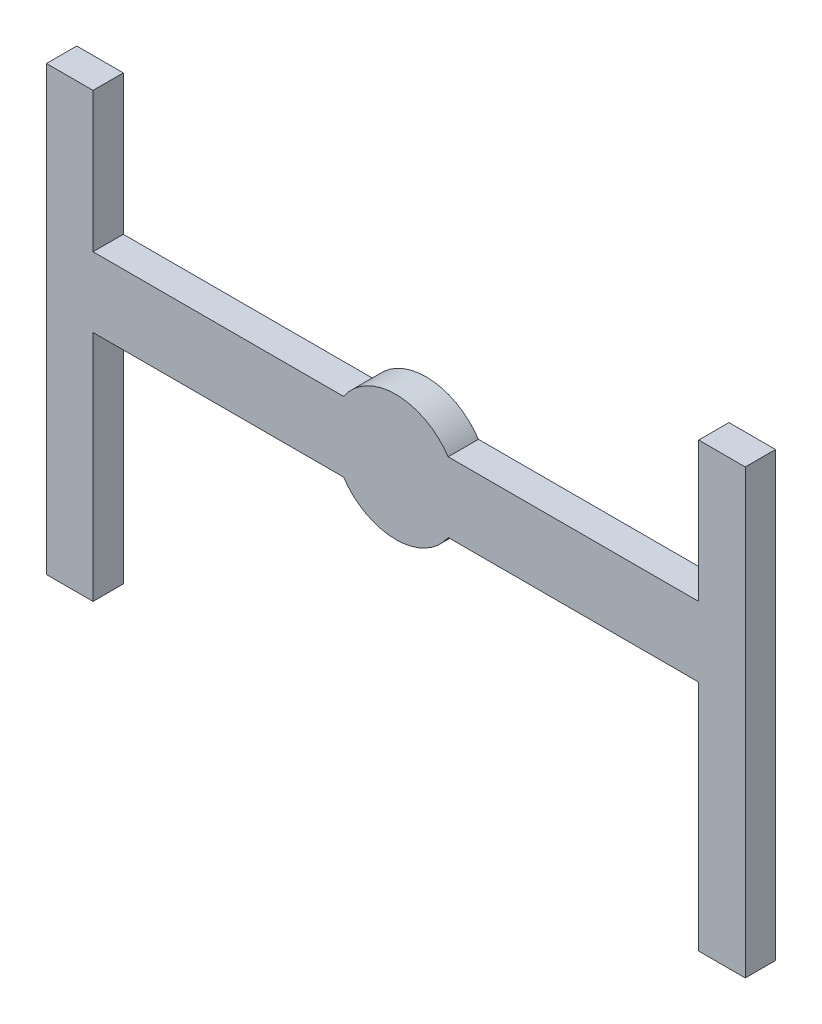
ISO-10303-21;
HEADER;
FILE_DESCRIPTION(('STEP AP214'),'2;1');
FILE_NAME('part.step','',(''),(''),'','','');
FILE_SCHEMA(('AUTOMOTIVE_DESIGN { 1 0 10303 214 1 1 1 1 }'));
ENDSEC;
DATA;
#1=APPLICATION_CONTEXT('core data for automotive mechanical design processes');
#2=APPLICATION_PROTOCOL_DEFINITION('international standard','automotive_design',2000,#1);
#3=PRODUCT_CONTEXT('',#1,'mechanical');
#4=PRODUCT('Part','Part','',(#3));
#5=PRODUCT_RELATED_PRODUCT_CATEGORY('part','',(#4));
#6=PRODUCT_DEFINITION_FORMATION('','',#4);
#7=PRODUCT_DEFINITION_CONTEXT('part definition',#1,'design');
#8=PRODUCT_DEFINITION('design','',#6,#7);
#9=PRODUCT_DEFINITION_SHAPE('','',#8);
#10=(LENGTH_UNIT() NAMED_UNIT(*) SI_UNIT(.MILLI.,.METRE.));
#11=(NAMED_UNIT(*) PLANE_ANGLE_UNIT() SI_UNIT($,.RADIAN.));
#12=(NAMED_UNIT(*) SI_UNIT($,.STERADIAN.) SOLID_ANGLE_UNIT());
#13=UNCERTAINTY_MEASURE_WITH_UNIT(LENGTH_MEASURE(1.E-05),#10,'distance_accuracy_value','');
#14=(GEOMETRIC_REPRESENTATION_CONTEXT(3) GLOBAL_UNCERTAINTY_ASSIGNED_CONTEXT((#13)) GLOBAL_UNIT_ASSIGNED_CONTEXT((#10,
#11,#12)) REPRESENTATION_CONTEXT('',''));
#15=CARTESIAN_POINT('',(0.,0.,0.));
#16=DIRECTION('',(0.,0.,1.));
#17=DIRECTION('',(1.,0.,0.));
#18=AXIS2_PLACEMENT_3D('',#15,#16,#17);
#19=CARTESIAN_POINT('',(-4.44089209850063E-13,1900.,-130.));
#20=DIRECTION('',(0.,-1.,0.));
#21=DIRECTION('',(0.,0.,-1.));
#22=AXIS2_PLACEMENT_3D('',#19,#20,#21);
#23=PLANE('',#22);
#24=DIRECTION('',(1.,0.,0.));
#25=VECTOR('',#24,1.);
#26=CARTESIAN_POINT('',(-4.44089209850063E-13,1900.,0.));
#27=LINE('',#26,#25);
#28=CARTESIAN_POINT('',(-4.44089209850063E-13,1900.,0.));
#29=VERTEX_POINT('',#28);
#30=CARTESIAN_POINT('',(200.,1900.,0.));
#31=VERTEX_POINT('',#30);
#32=EDGE_CURVE('E254',#29,#31,#27,.T.);
#33=ORIENTED_EDGE('',*,*,#32,.T.);
#34=DIRECTION('',(0.,0.,1.));
#35=VECTOR('',#34,1.);
#36=CARTESIAN_POINT('',(200.,1900.,-130.));
#37=LINE('',#36,#35);
#38=CARTESIAN_POINT('',(200.,1900.,-130.));
#39=VERTEX_POINT('',#38);
#40=EDGE_CURVE('E194',#39,#31,#37,.T.);
#41=ORIENTED_EDGE('',*,*,#40,.F.);
#42=DIRECTION('',(1.,0.,0.));
#43=VECTOR('',#42,1.);
#44=CARTESIAN_POINT('',(-4.44089209850063E-13,1900.,-130.));
#45=LINE('',#44,#43);
#46=CARTESIAN_POINT('',(-4.44089209850063E-13,1900.,-130.));
#47=VERTEX_POINT('',#46);
#48=EDGE_CURVE('E240',#47,#39,#45,.T.);
#49=ORIENTED_EDGE('',*,*,#48,.F.);
#50=DIRECTION('',(0.,0.,1.));
#51=VECTOR('',#50,1.);
#52=CARTESIAN_POINT('',(-4.44089209850063E-13,1900.,-130.));
#53=LINE('',#52,#51);
#54=EDGE_CURVE('E11',#47,#29,#53,.T.);
#55=ORIENTED_EDGE('',*,*,#54,.T.);
#56=EDGE_LOOP('',(#33,#41,#49,#55));
#57=FACE_BOUND('',#56,.T.);
#58=ADVANCED_FACE('F35',(#57),#23,.F.);
#59=CARTESIAN_POINT('',(0.,0.,-130.));
#60=DIRECTION('',(0.,-1.,0.));
#61=DIRECTION('',(0.,0.,-1.));
#62=AXIS2_PLACEMENT_3D('',#59,#60,#61);
#63=PLANE('',#62);
#64=DIRECTION('',(1.,0.,0.));
#65=VECTOR('',#64,1.);
#66=CARTESIAN_POINT('',(0.,0.,0.));
#67=LINE('',#66,#65);
#68=CARTESIAN_POINT('',(2800.,0.,0.));
#69=VERTEX_POINT('',#68);
#70=CARTESIAN_POINT('',(3000.,0.,0.));
#71=VERTEX_POINT('',#70);
#72=EDGE_CURVE('E260',#69,#71,#67,.T.);
#73=ORIENTED_EDGE('',*,*,#72,.F.);
#74=DIRECTION('',(0.,0.,1.));
#75=VECTOR('',#74,1.);
#76=CARTESIAN_POINT('',(2800.,0.,-130.));
#77=LINE('',#76,#75);
#78=CARTESIAN_POINT('',(2800.,0.,-130.));
#79=VERTEX_POINT('',#78);
#80=EDGE_CURVE('E227',#79,#69,#77,.T.);
#81=ORIENTED_EDGE('',*,*,#80,.F.);
#82=DIRECTION('',(1.,0.,0.));
#83=VECTOR('',#82,1.);
#84=CARTESIAN_POINT('',(0.,0.,-130.));
#85=LINE('',#84,#83);
#86=CARTESIAN_POINT('',(3000.,0.,-130.));
#87=VERTEX_POINT('',#86);
#88=EDGE_CURVE('E246',#79,#87,#85,.T.);
#89=ORIENTED_EDGE('',*,*,#88,.T.);
#90=DIRECTION('',(0.,0.,1.));
#91=VECTOR('',#90,1.);
#92=CARTESIAN_POINT('',(3000.,0.,-130.));
#93=LINE('',#92,#91);
#94=EDGE_CURVE('E264',#87,#71,#93,.T.);
#95=ORIENTED_EDGE('',*,*,#94,.T.);
#96=EDGE_LOOP('',(#73,#81,#89,#95));
#97=FACE_BOUND('',#96,.T.);
#98=ADVANCED_FACE('F284',(#97),#63,.T.);
#99=CARTESIAN_POINT('',(0.,0.,-130.));
#100=VERTEX_POINT('',#99);
#101=CARTESIAN_POINT('',(200.,0.,-130.));
#102=VERTEX_POINT('',#101);
#103=EDGE_CURVE('E247',#100,#102,#85,.T.);
#104=ORIENTED_EDGE('',*,*,#103,.T.);
#105=DIRECTION('',(0.,0.,1.));
#106=VECTOR('',#105,1.);
#107=CARTESIAN_POINT('',(200.,0.,-130.));
#108=LINE('',#107,#106);
#109=CARTESIAN_POINT('',(200.,0.,0.));
#110=VERTEX_POINT('',#109);
#111=EDGE_CURVE('E229',#102,#110,#108,.T.);
#112=ORIENTED_EDGE('',*,*,#111,.T.);
#113=CARTESIAN_POINT('',(0.,0.,0.));
#114=VERTEX_POINT('',#113);
#115=EDGE_CURVE('E239',#114,#110,#67,.T.);
#116=ORIENTED_EDGE('',*,*,#115,.F.);
#117=DIRECTION('',(0.,0.,1.));
#118=VECTOR('',#117,1.);
#119=CARTESIAN_POINT('',(0.,0.,-130.));
#120=LINE('',#119,#118);
#121=EDGE_CURVE('E250',#100,#114,#120,.T.);
#122=ORIENTED_EDGE('',*,*,#121,.F.);
#123=EDGE_LOOP('',(#104,#112,#116,#122));
#124=FACE_BOUND('',#123,.T.);
#125=ADVANCED_FACE('F305',(#124),#63,.T.);
#126=CARTESIAN_POINT('',(0.,0.,-130.));
#127=DIRECTION('',(0.,0.,-1.));
#128=DIRECTION('',(-1.,0.,0.));
#129=AXIS2_PLACEMENT_3D('',#126,#127,#128);
#130=PLANE('',#129);
#131=DIRECTION('',(0.,-1.,0.));
#132=VECTOR('',#131,1.);
#133=CARTESIAN_POINT('',(200.000000000001,0.,-130.));
#134=LINE('',#133,#132);
#135=CARTESIAN_POINT('',(200.,1300.,-130.));
#136=VERTEX_POINT('',#135);
#137=EDGE_CURVE('E178',#39,#136,#134,.T.);
#138=ORIENTED_EDGE('',*,*,#137,.T.);
#139=DIRECTION('',(1.,0.,0.));
#140=VECTOR('',#139,1.);
#141=CARTESIAN_POINT('',(0.,1300.,-130.));
#142=LINE('',#141,#140);
#143=CARTESIAN_POINT('',(1275.50055679356,1300.,-130.));
#144=VERTEX_POINT('',#143);
#145=EDGE_CURVE('E157',#136,#144,#142,.T.);
#146=ORIENTED_EDGE('',*,*,#145,.T.);
#147=CARTESIAN_POINT('',(1500.,1150.,-130.));
#148=DIRECTION('',(0.,0.,1.));
#149=DIRECTION('',(1.,0.,0.));
#150=AXIS2_PLACEMENT_3D('',#147,#148,#149);
#151=CIRCLE('',#150,270.);
#152=CARTESIAN_POINT('',(1724.49944320644,1300.,-130.));
#153=VERTEX_POINT('',#152);
#154=EDGE_CURVE('E151',#153,#144,#151,.T.);
#155=ORIENTED_EDGE('',*,*,#154,.F.);
#156=DIRECTION('',(1.,0.,0.));
#157=VECTOR('',#156,1.);
#158=CARTESIAN_POINT('',(0.,1300.,-130.));
#159=LINE('',#158,#157);
#160=CARTESIAN_POINT('',(2800.,1300.,-130.));
#161=VERTEX_POINT('',#160);
#162=EDGE_CURVE('E160',#153,#161,#159,.T.);
#163=ORIENTED_EDGE('',*,*,#162,.T.);
#164=DIRECTION('',(0.,1.,0.));
#165=VECTOR('',#164,1.);
#166=CARTESIAN_POINT('',(2800.,0.,-130.));
#167=LINE('',#166,#165);
#168=CARTESIAN_POINT('',(2800.,1900.,-130.));
#169=VERTEX_POINT('',#168);
#170=EDGE_CURVE('E165',#161,#169,#167,.T.);
#171=ORIENTED_EDGE('',*,*,#170,.T.);
#172=CARTESIAN_POINT('',(3000.,1900.,-130.));
#173=VERTEX_POINT('',#172);
#174=EDGE_CURVE('E238',#169,#173,#45,.T.);
#175=ORIENTED_EDGE('',*,*,#174,.T.);
#176=DIRECTION('',(0.,1.,0.));
#177=VECTOR('',#176,1.);
#178=CARTESIAN_POINT('',(3000.,0.,-130.));
#179=LINE('',#178,#177);
#180=EDGE_CURVE('E243',#87,#173,#179,.T.);
#181=ORIENTED_EDGE('',*,*,#180,.F.);
#182=ORIENTED_EDGE('',*,*,#88,.F.);
#183=DIRECTION('',(0.,-1.,0.));
#184=VECTOR('',#183,1.);
#185=CARTESIAN_POINT('',(2800.,0.,-130.));
#186=LINE('',#185,#184);
#187=CARTESIAN_POINT('',(2800.,1000.,-130.));
#188=VERTEX_POINT('',#187);
#189=EDGE_CURVE('E207',#188,#79,#186,.T.);
#190=ORIENTED_EDGE('',*,*,#189,.F.);
#191=DIRECTION('',(1.,0.,0.));
#192=VECTOR('',#191,1.);
#193=CARTESIAN_POINT('',(0.,1000.,-130.));
#194=LINE('',#193,#192);
#195=CARTESIAN_POINT('',(1724.49944320644,1000.,-130.));
#196=VERTEX_POINT('',#195);
#197=EDGE_CURVE('E209',#196,#188,#194,.T.);
#198=ORIENTED_EDGE('',*,*,#197,.F.);
#199=CARTESIAN_POINT('',(1500.,1150.,-130.));
#200=DIRECTION('',(0.,0.,1.));
#201=DIRECTION('',(1.,0.,0.));
#202=AXIS2_PLACEMENT_3D('',#199,#200,#201);
#203=CIRCLE('',#202,270.);
#204=CARTESIAN_POINT('',(1275.50055679356,1000.,-130.));
#205=VERTEX_POINT('',#204);
#206=EDGE_CURVE('E200',#205,#196,#203,.T.);
#207=ORIENTED_EDGE('',*,*,#206,.F.);
#208=DIRECTION('',(1.,0.,0.));
#209=VECTOR('',#208,1.);
#210=CARTESIAN_POINT('',(-1.03228493710418E-13,1000.,-130.));
#211=LINE('',#210,#209);
#212=CARTESIAN_POINT('',(200.,1000.,-130.));
#213=VERTEX_POINT('',#212);
#214=EDGE_CURVE('E202',#213,#205,#211,.T.);
#215=ORIENTED_EDGE('',*,*,#214,.F.);
#216=DIRECTION('',(0.,1.,0.));
#217=VECTOR('',#216,1.);
#218=CARTESIAN_POINT('',(200.,0.,-130.));
#219=LINE('',#218,#217);
#220=EDGE_CURVE('E205',#102,#213,#219,.T.);
#221=ORIENTED_EDGE('',*,*,#220,.F.);
#222=ORIENTED_EDGE('',*,*,#103,.F.);
#223=DIRECTION('',(0.,1.,0.));
#224=VECTOR('',#223,1.);
#225=CARTESIAN_POINT('',(0.,0.,-130.));
#226=LINE('',#225,#224);
#227=EDGE_CURVE('E235',#100,#47,#226,.T.);
#228=ORIENTED_EDGE('',*,*,#227,.T.);
#229=ORIENTED_EDGE('',*,*,#48,.T.);
#230=EDGE_LOOP('',(#138,#146,#155,#163,#171,#175,#181,#182,#190,#198,#207,#215,#221,#222,#228,#229));
#231=FACE_BOUND('',#230,.T.);
#232=ADVANCED_FACE('F169',(#231),#130,.T.);
#233=CARTESIAN_POINT('',(0.,0.,0.));
#234=DIRECTION('',(0.,0.,-1.));
#235=DIRECTION('',(-1.,0.,0.));
#236=AXIS2_PLACEMENT_3D('',#233,#234,#235);
#237=PLANE('',#236);
#238=DIRECTION('',(1.,0.,0.));
#239=VECTOR('',#238,1.);
#240=CARTESIAN_POINT('',(0.,1300.,0.));
#241=LINE('',#240,#239);
#242=CARTESIAN_POINT('',(200.,1300.,0.));
#243=VERTEX_POINT('',#242);
#244=CARTESIAN_POINT('',(1275.50055679356,1300.,0.));
#245=VERTEX_POINT('',#244);
#246=EDGE_CURVE('E171',#243,#245,#241,.T.);
#247=ORIENTED_EDGE('',*,*,#246,.F.);
#248=DIRECTION('',(0.,-1.,0.));
#249=VECTOR('',#248,1.);
#250=CARTESIAN_POINT('',(200.000000000001,0.,0.));
#251=LINE('',#250,#249);
#252=EDGE_CURVE('E174',#31,#243,#251,.T.);
#253=ORIENTED_EDGE('',*,*,#252,.F.);
#254=ORIENTED_EDGE('',*,*,#32,.F.);
#255=DIRECTION('',(0.,1.,0.));
#256=VECTOR('',#255,1.);
#257=CARTESIAN_POINT('',(0.,0.,0.));
#258=LINE('',#257,#256);
#259=EDGE_CURVE('E191',#114,#29,#258,.T.);
#260=ORIENTED_EDGE('',*,*,#259,.F.);
#261=ORIENTED_EDGE('',*,*,#115,.T.);
#262=DIRECTION('',(0.,1.,0.));
#263=VECTOR('',#262,1.);
#264=CARTESIAN_POINT('',(200.,0.,0.));
#265=LINE('',#264,#263);
#266=CARTESIAN_POINT('',(200.,1000.,0.));
#267=VERTEX_POINT('',#266);
#268=EDGE_CURVE('E216',#110,#267,#265,.T.);
#269=ORIENTED_EDGE('',*,*,#268,.T.);
#270=DIRECTION('',(1.,0.,0.));
#271=VECTOR('',#270,1.);
#272=CARTESIAN_POINT('',(-1.03228493710418E-13,1000.,0.));
#273=LINE('',#272,#271);
#274=CARTESIAN_POINT('',(1275.50055679356,1000.,0.));
#275=VERTEX_POINT('',#274);
#276=EDGE_CURVE('E213',#267,#275,#273,.T.);
#277=ORIENTED_EDGE('',*,*,#276,.T.);
#278=CARTESIAN_POINT('',(1500.,1150.,0.));
#279=DIRECTION('',(0.,0.,1.));
#280=DIRECTION('',(1.,0.,0.));
#281=AXIS2_PLACEMENT_3D('',#278,#279,#280);
#282=CIRCLE('',#281,270.);
#283=CARTESIAN_POINT('',(1724.49944320644,1000.,0.));
#284=VERTEX_POINT('',#283);
#285=EDGE_CURVE('E58',#275,#284,#282,.T.);
#286=ORIENTED_EDGE('',*,*,#285,.T.);
#287=DIRECTION('',(1.,0.,0.));
#288=VECTOR('',#287,1.);
#289=CARTESIAN_POINT('',(0.,1000.,0.));
#290=LINE('',#289,#288);
#291=CARTESIAN_POINT('',(2800.,1000.,0.));
#292=VERTEX_POINT('',#291);
#293=EDGE_CURVE('E203',#284,#292,#290,.T.);
#294=ORIENTED_EDGE('',*,*,#293,.T.);
#295=DIRECTION('',(0.,-1.,0.));
#296=VECTOR('',#295,1.);
#297=CARTESIAN_POINT('',(2800.,0.,0.));
#298=LINE('',#297,#296);
#299=EDGE_CURVE('E219',#292,#69,#298,.T.);
#300=ORIENTED_EDGE('',*,*,#299,.T.);
#301=ORIENTED_EDGE('',*,*,#72,.T.);
#302=DIRECTION('',(0.,1.,0.));
#303=VECTOR('',#302,1.);
#304=CARTESIAN_POINT('',(3000.,0.,0.));
#305=LINE('',#304,#303);
#306=CARTESIAN_POINT('',(3000.,1900.,0.));
#307=VERTEX_POINT('',#306);
#308=EDGE_CURVE('E257',#71,#307,#305,.T.);
#309=ORIENTED_EDGE('',*,*,#308,.T.);
#310=CARTESIAN_POINT('',(2800.,1900.,0.));
#311=VERTEX_POINT('',#310);
#312=EDGE_CURVE('E253',#311,#307,#27,.T.);
#313=ORIENTED_EDGE('',*,*,#312,.F.);
#314=DIRECTION('',(0.,1.,0.));
#315=VECTOR('',#314,1.);
#316=CARTESIAN_POINT('',(2800.,0.,0.));
#317=LINE('',#316,#315);
#318=CARTESIAN_POINT('',(2800.,1300.,0.));
#319=VERTEX_POINT('',#318);
#320=EDGE_CURVE('E185',#319,#311,#317,.T.);
#321=ORIENTED_EDGE('',*,*,#320,.F.);
#322=DIRECTION('',(1.,0.,0.));
#323=VECTOR('',#322,1.);
#324=CARTESIAN_POINT('',(0.,1300.,0.));
#325=LINE('',#324,#323);
#326=CARTESIAN_POINT('',(1724.49944320644,1300.,0.));
#327=VERTEX_POINT('',#326);
#328=EDGE_CURVE('E182',#327,#319,#325,.T.);
#329=ORIENTED_EDGE('',*,*,#328,.F.);
#330=CARTESIAN_POINT('',(1500.,1150.,0.));
#331=DIRECTION('',(0.,0.,1.));
#332=DIRECTION('',(1.,0.,0.));
#333=AXIS2_PLACEMENT_3D('',#330,#331,#332);
#334=CIRCLE('',#333,270.);
#335=EDGE_CURVE('E50',#327,#245,#334,.T.);
#336=ORIENTED_EDGE('',*,*,#335,.T.);
#337=EDGE_LOOP('',(#247,#253,#254,#260,#261,#269,#277,#286,#294,#300,#301,#309,#313,#321,#329,#336));
#338=FACE_BOUND('',#337,.T.);
#339=ADVANCED_FACE('F278',(#338),#237,.F.);
#340=CARTESIAN_POINT('',(0.,0.,-130.));
#341=DIRECTION('',(1.,0.,0.));
#342=DIRECTION('',(0.,1.,0.));
#343=AXIS2_PLACEMENT_3D('',#340,#341,#342);
#344=PLANE('',#343);
#345=ORIENTED_EDGE('',*,*,#259,.T.);
#346=ORIENTED_EDGE('',*,*,#54,.F.);
#347=ORIENTED_EDGE('',*,*,#227,.F.);
#348=ORIENTED_EDGE('',*,*,#121,.T.);
#349=EDGE_LOOP('',(#345,#346,#347,#348));
#350=FACE_BOUND('',#349,.T.);
#351=ADVANCED_FACE('F37',(#350),#344,.F.);
#352=ORIENTED_EDGE('',*,*,#174,.F.);
#353=DIRECTION('',(0.,0.,1.));
#354=VECTOR('',#353,1.);
#355=CARTESIAN_POINT('',(2800.,1900.,-130.));
#356=LINE('',#355,#354);
#357=EDGE_CURVE('E196',#169,#311,#356,.T.);
#358=ORIENTED_EDGE('',*,*,#357,.T.);
#359=ORIENTED_EDGE('',*,*,#312,.T.);
#360=DIRECTION('',(0.,0.,1.));
#361=VECTOR('',#360,1.);
#362=CARTESIAN_POINT('',(3000.,1900.,-130.));
#363=LINE('',#362,#361);
#364=EDGE_CURVE('E43',#173,#307,#363,.T.);
#365=ORIENTED_EDGE('',*,*,#364,.F.);
#366=EDGE_LOOP('',(#352,#358,#359,#365));
#367=FACE_BOUND('',#366,.T.);
#368=ADVANCED_FACE('F287',(#367),#23,.F.);
#369=CARTESIAN_POINT('',(3000.,0.,-130.));
#370=DIRECTION('',(1.,0.,0.));
#371=DIRECTION('',(0.,1.,0.));
#372=AXIS2_PLACEMENT_3D('',#369,#370,#371);
#373=PLANE('',#372);
#374=ORIENTED_EDGE('',*,*,#308,.F.);
#375=ORIENTED_EDGE('',*,*,#94,.F.);
#376=ORIENTED_EDGE('',*,*,#180,.T.);
#377=ORIENTED_EDGE('',*,*,#364,.T.);
#378=EDGE_LOOP('',(#374,#375,#376,#377));
#379=FACE_BOUND('',#378,.T.);
#380=ADVANCED_FACE('F270',(#379),#373,.T.);
#381=CARTESIAN_POINT('',(1500.,1150.,-130.));
#382=DIRECTION('',(0.,0.,1.));
#383=DIRECTION('',(1.,0.,0.));
#384=AXIS2_PLACEMENT_3D('',#381,#382,#383);
#385=CYLINDRICAL_SURFACE('',#384,270.);
#386=ORIENTED_EDGE('',*,*,#285,.F.);
#387=DIRECTION('',(0.,0.,1.));
#388=VECTOR('',#387,1.);
#389=CARTESIAN_POINT('',(1275.50055679356,1000.,-130.));
#390=LINE('',#389,#388);
#391=EDGE_CURVE('E211',#205,#275,#390,.T.);
#392=ORIENTED_EDGE('',*,*,#391,.F.);
#393=ORIENTED_EDGE('',*,*,#206,.T.);
#394=DIRECTION('',(0.,0.,1.));
#395=VECTOR('',#394,1.);
#396=CARTESIAN_POINT('',(1724.49944320644,1000.,-130.));
#397=LINE('',#396,#395);
#398=EDGE_CURVE('E183',#196,#284,#397,.T.);
#399=ORIENTED_EDGE('',*,*,#398,.T.);
#400=EDGE_LOOP('',(#386,#392,#393,#399));
#401=FACE_BOUND('',#400,.T.);
#402=ADVANCED_FACE('F315',(#401),#385,.T.);
#403=CARTESIAN_POINT('',(0.,1000.,-130.));
#404=DIRECTION('',(0.,-1.,0.));
#405=DIRECTION('',(0.,0.,-1.));
#406=AXIS2_PLACEMENT_3D('',#403,#404,#405);
#407=PLANE('',#406);
#408=ORIENTED_EDGE('',*,*,#293,.F.);
#409=ORIENTED_EDGE('',*,*,#398,.F.);
#410=ORIENTED_EDGE('',*,*,#197,.T.);
#411=DIRECTION('',(0.,0.,1.));
#412=VECTOR('',#411,1.);
#413=CARTESIAN_POINT('',(2800.,1000.,-130.));
#414=LINE('',#413,#412);
#415=EDGE_CURVE('E225',#188,#292,#414,.T.);
#416=ORIENTED_EDGE('',*,*,#415,.T.);
#417=EDGE_LOOP('',(#408,#409,#410,#416));
#418=FACE_BOUND('',#417,.T.);
#419=ADVANCED_FACE('F318',(#418),#407,.T.);
#420=CARTESIAN_POINT('',(2800.,0.,-130.));
#421=DIRECTION('',(-1.,0.,0.));
#422=DIRECTION('',(0.,0.,1.));
#423=AXIS2_PLACEMENT_3D('',#420,#421,#422);
#424=PLANE('',#423);
#425=ORIENTED_EDGE('',*,*,#299,.F.);
#426=ORIENTED_EDGE('',*,*,#415,.F.);
#427=ORIENTED_EDGE('',*,*,#189,.T.);
#428=ORIENTED_EDGE('',*,*,#80,.T.);
#429=EDGE_LOOP('',(#425,#426,#427,#428));
#430=FACE_BOUND('',#429,.T.);
#431=ADVANCED_FACE('F321',(#430),#424,.T.);
#432=CARTESIAN_POINT('',(200.,0.,-130.));
#433=DIRECTION('',(1.,0.,0.));
#434=DIRECTION('',(0.,1.,0.));
#435=AXIS2_PLACEMENT_3D('',#432,#433,#434);
#436=PLANE('',#435);
#437=ORIENTED_EDGE('',*,*,#268,.F.);
#438=ORIENTED_EDGE('',*,*,#111,.F.);
#439=ORIENTED_EDGE('',*,*,#220,.T.);
#440=DIRECTION('',(0.,0.,1.));
#441=VECTOR('',#440,1.);
#442=CARTESIAN_POINT('',(200.,1000.,-130.));
#443=LINE('',#442,#441);
#444=EDGE_CURVE('E232',#213,#267,#443,.T.);
#445=ORIENTED_EDGE('',*,*,#444,.T.);
#446=EDGE_LOOP('',(#437,#438,#439,#445));
#447=FACE_BOUND('',#446,.T.);
#448=ADVANCED_FACE('F307',(#447),#436,.T.);
#449=CARTESIAN_POINT('',(-1.03228493710418E-13,1000.,-130.));
#450=DIRECTION('',(0.,-1.,0.));
#451=DIRECTION('',(1.,0.,0.));
#452=AXIS2_PLACEMENT_3D('',#449,#450,#451);
#453=PLANE('',#452);
#454=ORIENTED_EDGE('',*,*,#276,.F.);
#455=ORIENTED_EDGE('',*,*,#444,.F.);
#456=ORIENTED_EDGE('',*,*,#214,.T.);
#457=ORIENTED_EDGE('',*,*,#391,.T.);
#458=EDGE_LOOP('',(#454,#455,#456,#457));
#459=FACE_BOUND('',#458,.T.);
#460=ADVANCED_FACE('F314',(#459),#453,.T.);
#461=CARTESIAN_POINT('',(1500.,1150.,-130.));
#462=DIRECTION('',(0.,0.,1.));
#463=DIRECTION('',(1.,0.,0.));
#464=AXIS2_PLACEMENT_3D('',#461,#462,#463);
#465=CYLINDRICAL_SURFACE('',#464,270.);
#466=ORIENTED_EDGE('',*,*,#335,.F.);
#467=DIRECTION('',(0.,0.,1.));
#468=VECTOR('',#467,1.);
#469=CARTESIAN_POINT('',(1724.49944320644,1300.,-130.));
#470=LINE('',#469,#468);
#471=EDGE_CURVE('E147',#153,#327,#470,.T.);
#472=ORIENTED_EDGE('',*,*,#471,.F.);
#473=ORIENTED_EDGE('',*,*,#154,.T.);
#474=DIRECTION('',(0.,0.,1.));
#475=VECTOR('',#474,1.);
#476=CARTESIAN_POINT('',(1275.50055679356,1300.,-130.));
#477=LINE('',#476,#475);
#478=EDGE_CURVE('E189',#144,#245,#477,.T.);
#479=ORIENTED_EDGE('',*,*,#478,.T.);
#480=EDGE_LOOP('',(#466,#472,#473,#479));
#481=FACE_BOUND('',#480,.T.);
#482=ADVANCED_FACE('F149',(#481),#465,.T.);
#483=CARTESIAN_POINT('',(0.,1300.,-130.));
#484=DIRECTION('',(0.,-1.,0.));
#485=DIRECTION('',(0.,0.,-1.));
#486=AXIS2_PLACEMENT_3D('',#483,#484,#485);
#487=PLANE('',#486);
#488=ORIENTED_EDGE('',*,*,#246,.T.);
#489=ORIENTED_EDGE('',*,*,#478,.F.);
#490=ORIENTED_EDGE('',*,*,#145,.F.);
#491=DIRECTION('',(0.,0.,1.));
#492=VECTOR('',#491,1.);
#493=CARTESIAN_POINT('',(200.,1300.,-130.));
#494=LINE('',#493,#492);
#495=EDGE_CURVE('E192',#136,#243,#494,.T.);
#496=ORIENTED_EDGE('',*,*,#495,.T.);
#497=EDGE_LOOP('',(#488,#489,#490,#496));
#498=FACE_BOUND('',#497,.T.);
#499=ADVANCED_FACE('F292',(#498),#487,.F.);
#500=CARTESIAN_POINT('',(200.000000000001,0.,-130.));
#501=DIRECTION('',(-1.,0.,0.));
#502=DIRECTION('',(0.,-1.,0.));
#503=AXIS2_PLACEMENT_3D('',#500,#501,#502);
#504=PLANE('',#503);
#505=ORIENTED_EDGE('',*,*,#252,.T.);
#506=ORIENTED_EDGE('',*,*,#495,.F.);
#507=ORIENTED_EDGE('',*,*,#137,.F.);
#508=ORIENTED_EDGE('',*,*,#40,.T.);
#509=EDGE_LOOP('',(#505,#506,#507,#508));
#510=FACE_BOUND('',#509,.T.);
#511=ADVANCED_FACE('F294',(#510),#504,.F.);
#512=CARTESIAN_POINT('',(2800.,0.,-130.));
#513=DIRECTION('',(1.,0.,0.));
#514=DIRECTION('',(0.,0.,-1.));
#515=AXIS2_PLACEMENT_3D('',#512,#513,#514);
#516=PLANE('',#515);
#517=ORIENTED_EDGE('',*,*,#320,.T.);
#518=ORIENTED_EDGE('',*,*,#357,.F.);
#519=ORIENTED_EDGE('',*,*,#170,.F.);
#520=DIRECTION('',(0.,0.,1.));
#521=VECTOR('',#520,1.);
#522=CARTESIAN_POINT('',(2800.,1300.,-130.));
#523=LINE('',#522,#521);
#524=EDGE_CURVE('E156',#161,#319,#523,.T.);
#525=ORIENTED_EDGE('',*,*,#524,.T.);
#526=EDGE_LOOP('',(#517,#518,#519,#525));
#527=FACE_BOUND('',#526,.T.);
#528=ADVANCED_FACE('F289',(#527),#516,.F.);
#529=CARTESIAN_POINT('',(0.,1300.,-130.));
#530=DIRECTION('',(0.,-1.,0.));
#531=DIRECTION('',(0.,0.,-1.));
#532=AXIS2_PLACEMENT_3D('',#529,#530,#531);
#533=PLANE('',#532);
#534=ORIENTED_EDGE('',*,*,#328,.T.);
#535=ORIENTED_EDGE('',*,*,#524,.F.);
#536=ORIENTED_EDGE('',*,*,#162,.F.);
#537=ORIENTED_EDGE('',*,*,#471,.T.);
#538=EDGE_LOOP('',(#534,#535,#536,#537));
#539=FACE_BOUND('',#538,.T.);
#540=ADVANCED_FACE('F161',(#539),#533,.F.);
#541=CLOSED_SHELL('',(#58,#98,#125,#232,#339,#351,#368,#380,#402,#419,#431,#448,#460,#482,#499,
#511,#528,#540));
#542=MANIFOLD_SOLID_BREP('B2',#541);
#543=ADVANCED_BREP_SHAPE_REPRESENTATION('',(#18,#542),#14);
#544=SHAPE_DEFINITION_REPRESENTATION(#9,#543);
ENDSEC;
END-ISO-10303-21;
